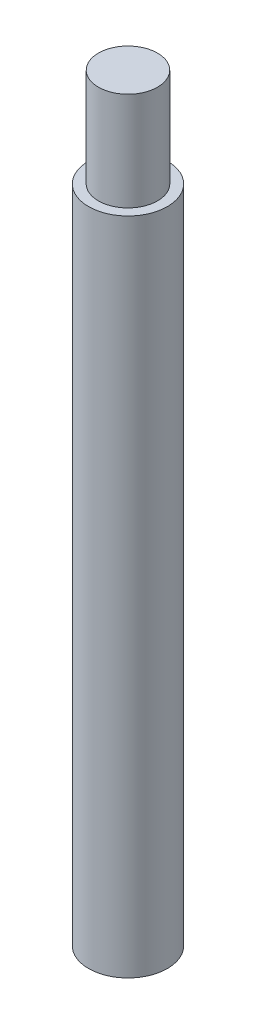
ISO-10303-21;
HEADER;
FILE_DESCRIPTION(('STEP AP214'),'2;1');
FILE_NAME('part.step','',(''),(''),'','','');
FILE_SCHEMA(('AUTOMOTIVE_DESIGN { 1 0 10303 214 1 1 1 1 }'));
ENDSEC;
DATA;
#1=APPLICATION_CONTEXT('core data for automotive mechanical design processes');
#2=APPLICATION_PROTOCOL_DEFINITION('international standard','automotive_design',2000,#1);
#3=PRODUCT_CONTEXT('',#1,'mechanical');
#4=PRODUCT('Part','Part','',(#3));
#5=PRODUCT_RELATED_PRODUCT_CATEGORY('part','',(#4));
#6=PRODUCT_DEFINITION_FORMATION('','',#4);
#7=PRODUCT_DEFINITION_CONTEXT('part definition',#1,'design');
#8=PRODUCT_DEFINITION('design','',#6,#7);
#9=PRODUCT_DEFINITION_SHAPE('','',#8);
#10=(LENGTH_UNIT() NAMED_UNIT(*) SI_UNIT(.MILLI.,.METRE.));
#11=(NAMED_UNIT(*) PLANE_ANGLE_UNIT() SI_UNIT($,.RADIAN.));
#12=(NAMED_UNIT(*) SI_UNIT($,.STERADIAN.) SOLID_ANGLE_UNIT());
#13=UNCERTAINTY_MEASURE_WITH_UNIT(LENGTH_MEASURE(1.E-05),#10,'distance_accuracy_value','');
#14=(GEOMETRIC_REPRESENTATION_CONTEXT(3) GLOBAL_UNCERTAINTY_ASSIGNED_CONTEXT((#13)) GLOBAL_UNIT_ASSIGNED_CONTEXT((#10,
#11,#12)) REPRESENTATION_CONTEXT('',''));
#15=CARTESIAN_POINT('',(0.,0.,0.));
#16=DIRECTION('',(0.,0.,1.));
#17=DIRECTION('',(1.,0.,0.));
#18=AXIS2_PLACEMENT_3D('',#15,#16,#17);
#19=CARTESIAN_POINT('',(0.,219.,0.));
#20=DIRECTION('',(0.,-1.,0.));
#21=DIRECTION('',(0.,0.,-1.));
#22=AXIS2_PLACEMENT_3D('',#19,#20,#21);
#23=CYLINDRICAL_SURFACE('',#22,8.);
#24=CARTESIAN_POINT('',(0.,65.,0.));
#25=DIRECTION('',(0.,1.,0.));
#26=DIRECTION('',(0.,0.,1.));
#27=AXIS2_PLACEMENT_3D('',#24,#25,#26);
#28=CIRCLE('',#27,8.);
#29=CARTESIAN_POINT('',(0.,65.,8.));
#30=VERTEX_POINT('',#29);
#31=EDGE_CURVE('E10',#30,#30,#28,.T.);
#32=ORIENTED_EDGE('',*,*,#31,.T.);
#33=EDGE_LOOP('',(#32));
#34=FACE_BOUND('',#33,.T.);
#35=CARTESIAN_POINT('',(0.,199.,0.));
#36=DIRECTION('',(0.,1.,0.));
#37=DIRECTION('',(0.,0.,1.));
#38=AXIS2_PLACEMENT_3D('',#35,#36,#37);
#39=CIRCLE('',#38,8.);
#40=CARTESIAN_POINT('',(0.,199.,8.));
#41=VERTEX_POINT('',#40);
#42=EDGE_CURVE('E32',#41,#41,#39,.T.);
#43=ORIENTED_EDGE('',*,*,#42,.F.);
#44=EDGE_LOOP('',(#43));
#45=FACE_BOUND('',#44,.T.);
#46=ADVANCED_FACE('F29',(#34,#45),#23,.T.);
#47=CARTESIAN_POINT('',(0.,65.,0.));
#48=DIRECTION('',(0.,1.,0.));
#49=DIRECTION('',(0.,0.,1.));
#50=AXIS2_PLACEMENT_3D('',#47,#48,#49);
#51=PLANE('',#50);
#52=ORIENTED_EDGE('',*,*,#31,.F.);
#53=EDGE_LOOP('',(#52));
#54=FACE_BOUND('',#53,.T.);
#55=ADVANCED_FACE('F53',(#54),#51,.F.);
#56=CARTESIAN_POINT('',(0.,199.,0.));
#57=DIRECTION('',(0.,1.,0.));
#58=DIRECTION('',(0.,0.,1.));
#59=AXIS2_PLACEMENT_3D('',#56,#57,#58);
#60=PLANE('',#59);
#61=CARTESIAN_POINT('',(0.,199.,0.));
#62=DIRECTION('',(0.,1.,0.));
#63=DIRECTION('',(0.,0.,1.));
#64=AXIS2_PLACEMENT_3D('',#61,#62,#63);
#65=CIRCLE('',#64,6.);
#66=CARTESIAN_POINT('',(0.,199.,6.));
#67=VERTEX_POINT('',#66);
#68=EDGE_CURVE('E39',#67,#67,#65,.T.);
#69=ORIENTED_EDGE('',*,*,#68,.F.);
#70=EDGE_LOOP('',(#69));
#71=FACE_BOUND('',#70,.T.);
#72=ORIENTED_EDGE('',*,*,#42,.T.);
#73=EDGE_LOOP('',(#72));
#74=FACE_BOUND('',#73,.T.);
#75=ADVANCED_FACE('F50',(#71,#74),#60,.T.);
#76=CARTESIAN_POINT('',(0.,199.,0.));
#77=DIRECTION('',(0.,1.,0.));
#78=DIRECTION('',(0.,0.,1.));
#79=AXIS2_PLACEMENT_3D('',#76,#77,#78);
#80=CYLINDRICAL_SURFACE('',#79,6.);
#81=ORIENTED_EDGE('',*,*,#68,.T.);
#82=EDGE_LOOP('',(#81));
#83=FACE_BOUND('',#82,.T.);
#84=CARTESIAN_POINT('',(0.,219.,0.));
#85=DIRECTION('',(0.,1.,0.));
#86=DIRECTION('',(0.,0.,1.));
#87=AXIS2_PLACEMENT_3D('',#84,#85,#86);
#88=CIRCLE('',#87,6.);
#89=CARTESIAN_POINT('',(0.,219.,6.));
#90=VERTEX_POINT('',#89);
#91=EDGE_CURVE('E41',#90,#90,#88,.T.);
#92=ORIENTED_EDGE('',*,*,#91,.F.);
#93=EDGE_LOOP('',(#92));
#94=FACE_BOUND('',#93,.T.);
#95=ADVANCED_FACE('F47',(#83,#94),#80,.T.);
#96=CARTESIAN_POINT('',(0.,219.,0.));
#97=DIRECTION('',(0.,1.,0.));
#98=DIRECTION('',(0.,0.,1.));
#99=AXIS2_PLACEMENT_3D('',#96,#97,#98);
#100=PLANE('',#99);
#101=ORIENTED_EDGE('',*,*,#91,.T.);
#102=EDGE_LOOP('',(#101));
#103=FACE_BOUND('',#102,.T.);
#104=ADVANCED_FACE('F65',(#103),#100,.T.);
#105=CLOSED_SHELL('',(#46,#55,#75,#95,#104));
#106=MANIFOLD_SOLID_BREP('B2',#105);
#107=ADVANCED_BREP_SHAPE_REPRESENTATION('',(#18,#106),#14);
#108=SHAPE_DEFINITION_REPRESENTATION(#9,#107);
ENDSEC;
END-ISO-10303-21;
